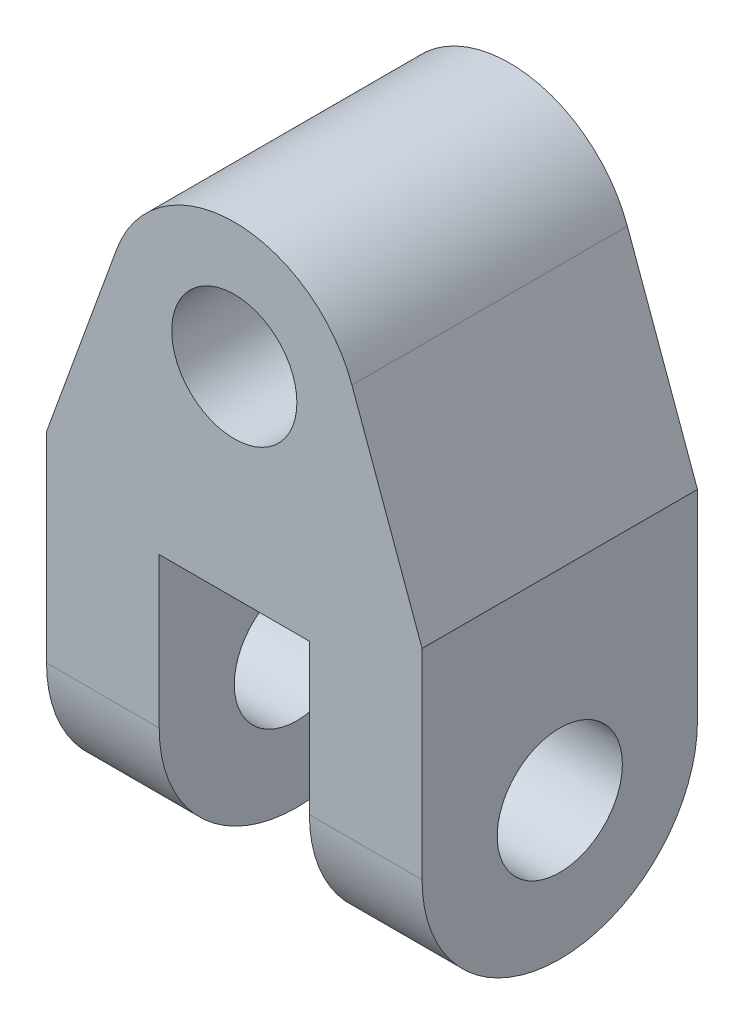
ISO-10303-21;
HEADER;
FILE_DESCRIPTION(('STEP AP214'),'2;1');
FILE_NAME('part.step','',(''),(''),'','','');
FILE_SCHEMA(('AUTOMOTIVE_DESIGN { 1 0 10303 214 1 1 1 1 }'));
ENDSEC;
DATA;
#1=APPLICATION_CONTEXT('core data for automotive mechanical design processes');
#2=APPLICATION_PROTOCOL_DEFINITION('international standard','automotive_design',2000,#1);
#3=PRODUCT_CONTEXT('',#1,'mechanical');
#4=PRODUCT('Part','Part','',(#3));
#5=PRODUCT_RELATED_PRODUCT_CATEGORY('part','',(#4));
#6=PRODUCT_DEFINITION_FORMATION('','',#4);
#7=PRODUCT_DEFINITION_CONTEXT('part definition',#1,'design');
#8=PRODUCT_DEFINITION('design','',#6,#7);
#9=PRODUCT_DEFINITION_SHAPE('','',#8);
#10=(LENGTH_UNIT() NAMED_UNIT(*) SI_UNIT(.MILLI.,.METRE.));
#11=(NAMED_UNIT(*) PLANE_ANGLE_UNIT() SI_UNIT($,.RADIAN.));
#12=(NAMED_UNIT(*) SI_UNIT($,.STERADIAN.) SOLID_ANGLE_UNIT());
#13=UNCERTAINTY_MEASURE_WITH_UNIT(LENGTH_MEASURE(1.E-05),#10,'distance_accuracy_value','');
#14=(GEOMETRIC_REPRESENTATION_CONTEXT(3) GLOBAL_UNCERTAINTY_ASSIGNED_CONTEXT((#13)) GLOBAL_UNIT_ASSIGNED_CONTEXT((#10,
#11,#12)) REPRESENTATION_CONTEXT('',''));
#15=CARTESIAN_POINT('',(0.,0.,0.));
#16=DIRECTION('',(0.,0.,1.));
#17=DIRECTION('',(1.,0.,0.));
#18=AXIS2_PLACEMENT_3D('',#15,#16,#17);
#19=CARTESIAN_POINT('',(-30000.,-24000.,44000.));
#20=DIRECTION('',(1.,0.,0.));
#21=DIRECTION('',(0.,1.,0.));
#22=AXIS2_PLACEMENT_3D('',#19,#20,#21);
#23=PLANE('',#22);
#24=CARTESIAN_POINT('',(-30000.,-56000.,22000.));
#25=DIRECTION('',(1.,0.,0.));
#26=DIRECTION('',(0.,0.,-1.));
#27=AXIS2_PLACEMENT_3D('',#24,#25,#26);
#28=CIRCLE('',#27,10000.);
#29=CARTESIAN_POINT('',(-30000.,-56000.,12000.));
#30=VERTEX_POINT('',#29);
#31=EDGE_CURVE('E207',#30,#30,#28,.T.);
#32=ORIENTED_EDGE('',*,*,#31,.T.);
#33=EDGE_LOOP('',(#32));
#34=FACE_BOUND('',#33,.T.);
#35=DIRECTION('',(0.,-1.,0.));
#36=VECTOR('',#35,1.);
#37=CARTESIAN_POINT('',(-30000.,-24000.,0.));
#38=LINE('',#37,#36);
#39=CARTESIAN_POINT('',(-30000.,-24000.,0.));
#40=VERTEX_POINT('',#39);
#41=CARTESIAN_POINT('',(-30000.,-56000.,0.));
#42=VERTEX_POINT('',#41);
#43=EDGE_CURVE('E140',#40,#42,#38,.T.);
#44=ORIENTED_EDGE('',*,*,#43,.T.);
#45=CARTESIAN_POINT('',(-30000.,-56000.,22000.));
#46=DIRECTION('',(1.,0.,0.));
#47=DIRECTION('',(0.,0.,-1.));
#48=AXIS2_PLACEMENT_3D('',#45,#46,#47);
#49=CIRCLE('',#48,22000.);
#50=CARTESIAN_POINT('',(-30000.,-56000.,44000.));
#51=VERTEX_POINT('',#50);
#52=EDGE_CURVE('E174',#51,#42,#49,.T.);
#53=ORIENTED_EDGE('',*,*,#52,.F.);
#54=DIRECTION('',(0.,-1.,0.));
#55=VECTOR('',#54,1.);
#56=CARTESIAN_POINT('',(-30000.,-24000.,44000.));
#57=LINE('',#56,#55);
#58=CARTESIAN_POINT('',(-30000.,-24000.,44000.));
#59=VERTEX_POINT('',#58);
#60=EDGE_CURVE('E225',#59,#51,#57,.T.);
#61=ORIENTED_EDGE('',*,*,#60,.F.);
#62=DIRECTION('',(0.,0.,-1.));
#63=VECTOR('',#62,1.);
#64=CARTESIAN_POINT('',(-30000.,-24000.,44000.));
#65=LINE('',#64,#63);
#66=EDGE_CURVE('E154',#59,#40,#65,.T.);
#67=ORIENTED_EDGE('',*,*,#66,.T.);
#68=EDGE_LOOP('',(#44,#53,#61,#67));
#69=FACE_BOUND('',#68,.T.);
#70=ADVANCED_FACE('F32',(#34,#69),#23,.F.);
#71=CARTESIAN_POINT('',(-12000.,-78000.,44000.));
#72=DIRECTION('',(-1.,0.,0.));
#73=DIRECTION('',(0.,0.,1.));
#74=AXIS2_PLACEMENT_3D('',#71,#72,#73);
#75=PLANE('',#74);
#76=CARTESIAN_POINT('',(-12000.,-56000.,22000.));
#77=DIRECTION('',(-1.,0.,0.));
#78=DIRECTION('',(0.,0.,1.));
#79=AXIS2_PLACEMENT_3D('',#76,#77,#78);
#80=CIRCLE('',#79,10000.);
#81=CARTESIAN_POINT('',(-12000.,-56000.,32000.));
#82=VERTEX_POINT('',#81);
#83=EDGE_CURVE('E215',#82,#82,#80,.T.);
#84=ORIENTED_EDGE('',*,*,#83,.T.);
#85=EDGE_LOOP('',(#84));
#86=FACE_BOUND('',#85,.T.);
#87=CARTESIAN_POINT('',(-12000.,-56000.,22000.));
#88=DIRECTION('',(-1.,0.,0.));
#89=DIRECTION('',(0.,0.,1.));
#90=AXIS2_PLACEMENT_3D('',#87,#88,#89);
#91=CIRCLE('',#90,22000.);
#92=CARTESIAN_POINT('',(-12000.,-56000.,0.));
#93=VERTEX_POINT('',#92);
#94=CARTESIAN_POINT('',(-12000.,-56000.,44000.));
#95=VERTEX_POINT('',#94);
#96=EDGE_CURVE('E191',#93,#95,#91,.T.);
#97=ORIENTED_EDGE('',*,*,#96,.F.);
#98=DIRECTION('',(0.,1.,0.));
#99=VECTOR('',#98,1.);
#100=CARTESIAN_POINT('',(-12000.,-78000.,0.));
#101=LINE('',#100,#99);
#102=CARTESIAN_POINT('',(-12000.,-32000.,0.));
#103=VERTEX_POINT('',#102);
#104=EDGE_CURVE('E143',#93,#103,#101,.T.);
#105=ORIENTED_EDGE('',*,*,#104,.T.);
#106=DIRECTION('',(0.,0.,-1.));
#107=VECTOR('',#106,1.);
#108=CARTESIAN_POINT('',(-12000.,-32000.,44000.));
#109=LINE('',#108,#107);
#110=CARTESIAN_POINT('',(-12000.,-32000.,44000.));
#111=VERTEX_POINT('',#110);
#112=EDGE_CURVE('E120',#111,#103,#109,.T.);
#113=ORIENTED_EDGE('',*,*,#112,.F.);
#114=DIRECTION('',(0.,1.,0.));
#115=VECTOR('',#114,1.);
#116=CARTESIAN_POINT('',(-12000.,-78000.,44000.));
#117=LINE('',#116,#115);
#118=EDGE_CURVE('E107',#95,#111,#117,.T.);
#119=ORIENTED_EDGE('',*,*,#118,.F.);
#120=EDGE_LOOP('',(#97,#105,#113,#119));
#121=FACE_BOUND('',#120,.T.);
#122=ADVANCED_FACE('F227',(#86,#121),#75,.F.);
#123=CARTESIAN_POINT('',(12000.,-32000.,44000.));
#124=DIRECTION('',(1.,0.,0.));
#125=DIRECTION('',(0.,1.,0.));
#126=AXIS2_PLACEMENT_3D('',#123,#124,#125);
#127=PLANE('',#126);
#128=CARTESIAN_POINT('',(12000.,-56000.,22000.));
#129=DIRECTION('',(1.,0.,0.));
#130=DIRECTION('',(0.,1.,0.));
#131=AXIS2_PLACEMENT_3D('',#128,#129,#130);
#132=CIRCLE('',#131,10000.);
#133=CARTESIAN_POINT('',(12000.,-46000.,22000.));
#134=VERTEX_POINT('',#133);
#135=EDGE_CURVE('E210',#134,#134,#132,.T.);
#136=ORIENTED_EDGE('',*,*,#135,.T.);
#137=EDGE_LOOP('',(#136));
#138=FACE_BOUND('',#137,.T.);
#139=DIRECTION('',(0.,-1.,0.));
#140=VECTOR('',#139,1.);
#141=CARTESIAN_POINT('',(12000.,-32000.,0.));
#142=LINE('',#141,#140);
#143=CARTESIAN_POINT('',(12000.,-32000.,0.));
#144=VERTEX_POINT('',#143);
#145=CARTESIAN_POINT('',(12000.,-56000.,0.));
#146=VERTEX_POINT('',#145);
#147=EDGE_CURVE('E146',#144,#146,#142,.T.);
#148=ORIENTED_EDGE('',*,*,#147,.T.);
#149=CARTESIAN_POINT('',(12000.,-56000.,22000.));
#150=DIRECTION('',(1.,0.,0.));
#151=DIRECTION('',(0.,1.,0.));
#152=AXIS2_PLACEMENT_3D('',#149,#150,#151);
#153=CIRCLE('',#152,22000.);
#154=CARTESIAN_POINT('',(12000.,-56000.,44000.));
#155=VERTEX_POINT('',#154);
#156=EDGE_CURVE('E126',#155,#146,#153,.T.);
#157=ORIENTED_EDGE('',*,*,#156,.F.);
#158=DIRECTION('',(0.,-1.,0.));
#159=VECTOR('',#158,1.);
#160=CARTESIAN_POINT('',(12000.,-32000.,44000.));
#161=LINE('',#160,#159);
#162=CARTESIAN_POINT('',(12000.,-32000.,44000.));
#163=VERTEX_POINT('',#162);
#164=EDGE_CURVE('E104',#163,#155,#161,.T.);
#165=ORIENTED_EDGE('',*,*,#164,.F.);
#166=DIRECTION('',(0.,0.,-1.));
#167=VECTOR('',#166,1.);
#168=CARTESIAN_POINT('',(12000.,-32000.,44000.));
#169=LINE('',#168,#167);
#170=EDGE_CURVE('E113',#163,#144,#169,.T.);
#171=ORIENTED_EDGE('',*,*,#170,.T.);
#172=EDGE_LOOP('',(#148,#157,#165,#171));
#173=FACE_BOUND('',#172,.T.);
#174=ADVANCED_FACE('F124',(#138,#173),#127,.F.);
#175=CARTESIAN_POINT('',(30000.,-78000.,44000.));
#176=DIRECTION('',(-1.,0.,0.));
#177=DIRECTION('',(0.,0.,1.));
#178=AXIS2_PLACEMENT_3D('',#175,#176,#177);
#179=PLANE('',#178);
#180=CARTESIAN_POINT('',(30000.,-56000.,22000.));
#181=DIRECTION('',(1.,0.,0.));
#182=DIRECTION('',(0.,0.,-1.));
#183=AXIS2_PLACEMENT_3D('',#180,#181,#182);
#184=CIRCLE('',#183,10000.);
#185=CARTESIAN_POINT('',(30000.,-56000.,12000.));
#186=VERTEX_POINT('',#185);
#187=EDGE_CURVE('E206',#186,#186,#184,.T.);
#188=ORIENTED_EDGE('',*,*,#187,.F.);
#189=EDGE_LOOP('',(#188));
#190=FACE_BOUND('',#189,.T.);
#191=CARTESIAN_POINT('',(30000.,-56000.,22000.));
#192=DIRECTION('',(1.,0.,0.));
#193=DIRECTION('',(0.,0.,-1.));
#194=AXIS2_PLACEMENT_3D('',#191,#192,#193);
#195=CIRCLE('',#194,22000.);
#196=CARTESIAN_POINT('',(30000.,-56000.,44000.));
#197=VERTEX_POINT('',#196);
#198=CARTESIAN_POINT('',(30000.,-56000.,0.));
#199=VERTEX_POINT('',#198);
#200=EDGE_CURVE('E197',#197,#199,#195,.T.);
#201=ORIENTED_EDGE('',*,*,#200,.T.);
#202=DIRECTION('',(0.,1.,0.));
#203=VECTOR('',#202,1.);
#204=CARTESIAN_POINT('',(30000.,-78000.,0.));
#205=LINE('',#204,#203);
#206=CARTESIAN_POINT('',(30000.,-24000.,0.));
#207=VERTEX_POINT('',#206);
#208=EDGE_CURVE('E73',#199,#207,#205,.T.);
#209=ORIENTED_EDGE('',*,*,#208,.T.);
#210=DIRECTION('',(0.,0.,-1.));
#211=VECTOR('',#210,1.);
#212=CARTESIAN_POINT('',(30000.,-24000.,44000.));
#213=LINE('',#212,#211);
#214=CARTESIAN_POINT('',(30000.,-24000.,44000.));
#215=VERTEX_POINT('',#214);
#216=EDGE_CURVE('E121',#215,#207,#213,.T.);
#217=ORIENTED_EDGE('',*,*,#216,.F.);
#218=DIRECTION('',(0.,1.,0.));
#219=VECTOR('',#218,1.);
#220=CARTESIAN_POINT('',(30000.,-78000.,44000.));
#221=LINE('',#220,#219);
#222=EDGE_CURVE('E127',#197,#215,#221,.T.);
#223=ORIENTED_EDGE('',*,*,#222,.F.);
#224=EDGE_LOOP('',(#201,#209,#217,#223));
#225=FACE_BOUND('',#224,.T.);
#226=ADVANCED_FACE('F230',(#190,#225),#179,.F.);
#227=CARTESIAN_POINT('',(0.,0.,0.));
#228=DIRECTION('',(0.,0.,1.));
#229=DIRECTION('',(1.,0.,0.));
#230=AXIS2_PLACEMENT_3D('',#227,#228,#229);
#231=PLANE('',#230);
#232=CARTESIAN_POINT('',(0.,0.,0.));
#233=DIRECTION('',(0.,0.,1.));
#234=DIRECTION('',(1.,0.,0.));
#235=AXIS2_PLACEMENT_3D('',#232,#233,#234);
#236=CIRCLE('',#235,10000.);
#237=CARTESIAN_POINT('',(10000.,0.,0.));
#238=VERTEX_POINT('',#237);
#239=EDGE_CURVE('E218',#238,#238,#236,.T.);
#240=ORIENTED_EDGE('',*,*,#239,.T.);
#241=EDGE_LOOP('',(#240));
#242=FACE_BOUND('',#241,.T.);
#243=DIRECTION('',(1.,0.,0.));
#244=VECTOR('',#243,1.);
#245=CARTESIAN_POINT('',(-30000.,-56000.,0.));
#246=LINE('',#245,#244);
#247=EDGE_CURVE('E168',#42,#93,#246,.T.);
#248=ORIENTED_EDGE('',*,*,#247,.F.);
#249=ORIENTED_EDGE('',*,*,#43,.F.);
#250=DIRECTION('',(-0.34151298645759,-0.939877055832739,0.));
#251=VECTOR('',#250,1.);
#252=CARTESIAN_POINT('',(-18797.5411166548,6830.25972915181,0.));
#253=LINE('',#252,#251);
#254=CARTESIAN_POINT('',(-18797.5411166548,6830.25972915181,0.));
#255=VERTEX_POINT('',#254);
#256=EDGE_CURVE('E137',#255,#40,#253,.T.);
#257=ORIENTED_EDGE('',*,*,#256,.F.);
#258=CARTESIAN_POINT('',(0.,0.,0.));
#259=DIRECTION('',(0.,0.,1.));
#260=DIRECTION('',(1.,0.,0.));
#261=AXIS2_PLACEMENT_3D('',#258,#259,#260);
#262=CIRCLE('',#261,20000.);
#263=CARTESIAN_POINT('',(18797.5411166548,6830.25972915182,0.));
#264=VERTEX_POINT('',#263);
#265=EDGE_CURVE('E134',#264,#255,#262,.T.);
#266=ORIENTED_EDGE('',*,*,#265,.F.);
#267=DIRECTION('',(-0.341512986457591,0.939877055832739,0.));
#268=VECTOR('',#267,1.);
#269=CARTESIAN_POINT('',(18797.5411166548,6830.25972915182,0.));
#270=LINE('',#269,#268);
#271=EDGE_CURVE('E79',#207,#264,#270,.T.);
#272=ORIENTED_EDGE('',*,*,#271,.F.);
#273=ORIENTED_EDGE('',*,*,#208,.F.);
#274=DIRECTION('',(1.,0.,0.));
#275=VECTOR('',#274,1.);
#276=CARTESIAN_POINT('',(-30000.,-56000.,0.));
#277=LINE('',#276,#275);
#278=EDGE_CURVE('E11',#146,#199,#277,.T.);
#279=ORIENTED_EDGE('',*,*,#278,.F.);
#280=ORIENTED_EDGE('',*,*,#147,.F.);
#281=DIRECTION('',(1.,0.,0.));
#282=VECTOR('',#281,1.);
#283=CARTESIAN_POINT('',(-12000.,-32000.,0.));
#284=LINE('',#283,#282);
#285=EDGE_CURVE('E116',#103,#144,#284,.T.);
#286=ORIENTED_EDGE('',*,*,#285,.F.);
#287=ORIENTED_EDGE('',*,*,#104,.F.);
#288=EDGE_LOOP('',(#248,#249,#257,#266,#272,#273,#279,#280,#286,#287));
#289=FACE_BOUND('',#288,.T.);
#290=ADVANCED_FACE('F163',(#242,#289),#231,.F.);
#291=CARTESIAN_POINT('',(0.,0.,44000.));
#292=DIRECTION('',(0.,0.,1.));
#293=DIRECTION('',(1.,0.,0.));
#294=AXIS2_PLACEMENT_3D('',#291,#292,#293);
#295=PLANE('',#294);
#296=CARTESIAN_POINT('',(0.,0.,44000.));
#297=DIRECTION('',(0.,0.,1.));
#298=DIRECTION('',(1.,0.,0.));
#299=AXIS2_PLACEMENT_3D('',#296,#297,#298);
#300=CIRCLE('',#299,10000.);
#301=CARTESIAN_POINT('',(10000.,0.,44000.));
#302=VERTEX_POINT('',#301);
#303=EDGE_CURVE('E138',#302,#302,#300,.T.);
#304=ORIENTED_EDGE('',*,*,#303,.F.);
#305=EDGE_LOOP('',(#304));
#306=FACE_BOUND('',#305,.T.);
#307=ORIENTED_EDGE('',*,*,#60,.T.);
#308=DIRECTION('',(1.,0.,0.));
#309=VECTOR('',#308,1.);
#310=CARTESIAN_POINT('',(-30000.,-56000.,44000.));
#311=LINE('',#310,#309);
#312=EDGE_CURVE('E199',#51,#95,#311,.T.);
#313=ORIENTED_EDGE('',*,*,#312,.T.);
#314=ORIENTED_EDGE('',*,*,#118,.T.);
#315=DIRECTION('',(1.,0.,0.));
#316=VECTOR('',#315,1.);
#317=CARTESIAN_POINT('',(-12000.,-32000.,44000.));
#318=LINE('',#317,#316);
#319=EDGE_CURVE('E98',#111,#163,#318,.T.);
#320=ORIENTED_EDGE('',*,*,#319,.T.);
#321=ORIENTED_EDGE('',*,*,#164,.T.);
#322=EDGE_CURVE('E194',#155,#197,#311,.T.);
#323=ORIENTED_EDGE('',*,*,#322,.T.);
#324=ORIENTED_EDGE('',*,*,#222,.T.);
#325=DIRECTION('',(-0.341512986457591,0.939877055832739,0.));
#326=VECTOR('',#325,1.);
#327=CARTESIAN_POINT('',(18797.5411166548,6830.25972915182,44000.));
#328=LINE('',#327,#326);
#329=CARTESIAN_POINT('',(18797.5411166548,6830.25972915182,44000.));
#330=VERTEX_POINT('',#329);
#331=EDGE_CURVE('E49',#215,#330,#328,.T.);
#332=ORIENTED_EDGE('',*,*,#331,.T.);
#333=CARTESIAN_POINT('',(0.,0.,44000.));
#334=DIRECTION('',(0.,0.,1.));
#335=DIRECTION('',(1.,0.,0.));
#336=AXIS2_PLACEMENT_3D('',#333,#334,#335);
#337=CIRCLE('',#336,20000.);
#338=CARTESIAN_POINT('',(-18797.5411166548,6830.25972915181,44000.));
#339=VERTEX_POINT('',#338);
#340=EDGE_CURVE('E150',#330,#339,#337,.T.);
#341=ORIENTED_EDGE('',*,*,#340,.T.);
#342=DIRECTION('',(-0.34151298645759,-0.939877055832739,0.));
#343=VECTOR('',#342,1.);
#344=CARTESIAN_POINT('',(-18797.5411166548,6830.25972915181,44000.));
#345=LINE('',#344,#343);
#346=EDGE_CURVE('E88',#339,#59,#345,.T.);
#347=ORIENTED_EDGE('',*,*,#346,.T.);
#348=EDGE_LOOP('',(#307,#313,#314,#320,#321,#323,#324,#332,#341,#347));
#349=FACE_BOUND('',#348,.T.);
#350=ADVANCED_FACE('F101',(#306,#349),#295,.T.);
#351=CARTESIAN_POINT('',(0.,0.,44000.));
#352=DIRECTION('',(0.,0.,-1.));
#353=DIRECTION('',(-1.,0.,0.));
#354=AXIS2_PLACEMENT_3D('',#351,#352,#353);
#355=CYLINDRICAL_SURFACE('',#354,20000.);
#356=ORIENTED_EDGE('',*,*,#265,.T.);
#357=DIRECTION('',(0.,0.,-1.));
#358=VECTOR('',#357,1.);
#359=CARTESIAN_POINT('',(-18797.5411166548,6830.25972915181,44000.));
#360=LINE('',#359,#358);
#361=EDGE_CURVE('E41',#339,#255,#360,.T.);
#362=ORIENTED_EDGE('',*,*,#361,.F.);
#363=ORIENTED_EDGE('',*,*,#340,.F.);
#364=DIRECTION('',(0.,0.,-1.));
#365=VECTOR('',#364,1.);
#366=CARTESIAN_POINT('',(18797.5411166548,6830.25972915182,44000.));
#367=LINE('',#366,#365);
#368=EDGE_CURVE('E133',#330,#264,#367,.T.);
#369=ORIENTED_EDGE('',*,*,#368,.T.);
#370=EDGE_LOOP('',(#356,#362,#363,#369));
#371=FACE_BOUND('',#370,.T.);
#372=ADVANCED_FACE('F34',(#371),#355,.T.);
#373=CARTESIAN_POINT('',(-18797.5411166548,6830.25972915181,44000.));
#374=DIRECTION('',(0.939877055832739,-0.34151298645759,0.));
#375=DIRECTION('',(0.34151298645759,0.939877055832739,0.));
#376=AXIS2_PLACEMENT_3D('',#373,#374,#375);
#377=PLANE('',#376);
#378=ORIENTED_EDGE('',*,*,#256,.T.);
#379=ORIENTED_EDGE('',*,*,#66,.F.);
#380=ORIENTED_EDGE('',*,*,#346,.F.);
#381=ORIENTED_EDGE('',*,*,#361,.T.);
#382=EDGE_LOOP('',(#378,#379,#380,#381));
#383=FACE_BOUND('',#382,.T.);
#384=ADVANCED_FACE('F157',(#383),#377,.F.);
#385=CARTESIAN_POINT('',(-12000.,-32000.,44000.));
#386=DIRECTION('',(0.,1.,0.));
#387=DIRECTION('',(0.,0.,1.));
#388=AXIS2_PLACEMENT_3D('',#385,#386,#387);
#389=PLANE('',#388);
#390=ORIENTED_EDGE('',*,*,#285,.T.);
#391=ORIENTED_EDGE('',*,*,#170,.F.);
#392=ORIENTED_EDGE('',*,*,#319,.F.);
#393=ORIENTED_EDGE('',*,*,#112,.T.);
#394=EDGE_LOOP('',(#390,#391,#392,#393));
#395=FACE_BOUND('',#394,.T.);
#396=ADVANCED_FACE('F114',(#395),#389,.F.);
#397=CARTESIAN_POINT('',(18797.5411166548,6830.25972915182,44000.));
#398=DIRECTION('',(-0.939877055832739,-0.341512986457591,0.));
#399=DIRECTION('',(0.341512986457591,-0.939877055832739,0.));
#400=AXIS2_PLACEMENT_3D('',#397,#398,#399);
#401=PLANE('',#400);
#402=ORIENTED_EDGE('',*,*,#271,.T.);
#403=ORIENTED_EDGE('',*,*,#368,.F.);
#404=ORIENTED_EDGE('',*,*,#331,.F.);
#405=ORIENTED_EDGE('',*,*,#216,.T.);
#406=EDGE_LOOP('',(#402,#403,#404,#405));
#407=FACE_BOUND('',#406,.T.);
#408=ADVANCED_FACE('F231',(#407),#401,.F.);
#409=CARTESIAN_POINT('',(0.,0.,44000.));
#410=DIRECTION('',(0.,0.,-1.));
#411=DIRECTION('',(-1.,0.,0.));
#412=AXIS2_PLACEMENT_3D('',#409,#410,#411);
#413=CYLINDRICAL_SURFACE('',#412,10000.);
#414=ORIENTED_EDGE('',*,*,#303,.T.);
#415=EDGE_LOOP('',(#414));
#416=FACE_BOUND('',#415,.T.);
#417=ORIENTED_EDGE('',*,*,#239,.F.);
#418=EDGE_LOOP('',(#417));
#419=FACE_BOUND('',#418,.T.);
#420=ADVANCED_FACE('F233',(#416,#419),#413,.F.);
#421=CARTESIAN_POINT('',(-30000.,-56000.,22000.));
#422=DIRECTION('',(1.,0.,0.));
#423=DIRECTION('',(0.,0.,-1.));
#424=AXIS2_PLACEMENT_3D('',#421,#422,#423);
#425=CYLINDRICAL_SURFACE('',#424,10000.);
#426=ORIENTED_EDGE('',*,*,#187,.T.);
#427=EDGE_LOOP('',(#426));
#428=FACE_BOUND('',#427,.T.);
#429=ORIENTED_EDGE('',*,*,#135,.F.);
#430=EDGE_LOOP('',(#429));
#431=FACE_BOUND('',#430,.T.);
#432=ADVANCED_FACE('F239',(#428,#431),#425,.F.);
#433=ORIENTED_EDGE('',*,*,#31,.F.);
#434=EDGE_LOOP('',(#433));
#435=FACE_BOUND('',#434,.T.);
#436=ORIENTED_EDGE('',*,*,#83,.F.);
#437=EDGE_LOOP('',(#436));
#438=FACE_BOUND('',#437,.T.);
#439=ADVANCED_FACE('F268',(#435,#438),#425,.F.);
#440=CARTESIAN_POINT('',(-30000.,-56000.,22000.));
#441=DIRECTION('',(1.,0.,0.));
#442=DIRECTION('',(0.,0.,-1.));
#443=AXIS2_PLACEMENT_3D('',#440,#441,#442);
#444=CYLINDRICAL_SURFACE('',#443,22000.);
#445=ORIENTED_EDGE('',*,*,#156,.T.);
#446=ORIENTED_EDGE('',*,*,#278,.T.);
#447=ORIENTED_EDGE('',*,*,#200,.F.);
#448=ORIENTED_EDGE('',*,*,#322,.F.);
#449=EDGE_LOOP('',(#445,#446,#447,#448));
#450=FACE_BOUND('',#449,.T.);
#451=ADVANCED_FACE('F195',(#450),#444,.T.);
#452=ORIENTED_EDGE('',*,*,#96,.T.);
#453=ORIENTED_EDGE('',*,*,#312,.F.);
#454=ORIENTED_EDGE('',*,*,#52,.T.);
#455=ORIENTED_EDGE('',*,*,#247,.T.);
#456=EDGE_LOOP('',(#452,#453,#454,#455));
#457=FACE_BOUND('',#456,.T.);
#458=ADVANCED_FACE('F228',(#457),#444,.T.);
#459=CLOSED_SHELL('',(#70,#122,#174,#226,#290,#350,#372,#384,#396,#408,#420,#432,#439,#451,#458));
#460=MANIFOLD_SOLID_BREP('B2',#459);
#461=ADVANCED_BREP_SHAPE_REPRESENTATION('',(#18,#460),#14);
#462=SHAPE_DEFINITION_REPRESENTATION(#9,#461);
ENDSEC;
END-ISO-10303-21;
